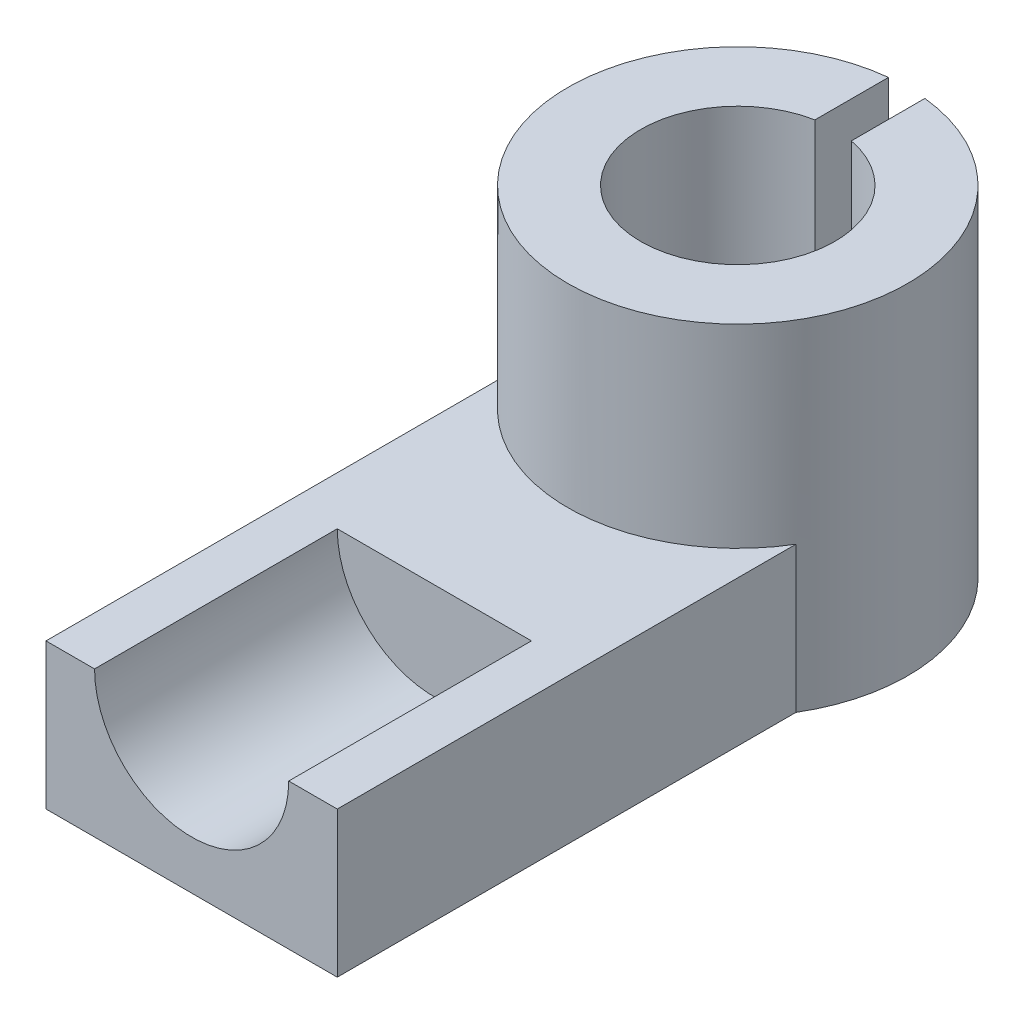
ISO-10303-21;
HEADER;
FILE_DESCRIPTION(('STEP AP214'),'2;1');
FILE_NAME('part.step','',(''),(''),'','','');
FILE_SCHEMA(('AUTOMOTIVE_DESIGN { 1 0 10303 214 1 1 1 1 }'));
ENDSEC;
DATA;
#1=APPLICATION_CONTEXT('core data for automotive mechanical design processes');
#2=APPLICATION_PROTOCOL_DEFINITION('international standard','automotive_design',2000,#1);
#3=PRODUCT_CONTEXT('',#1,'mechanical');
#4=PRODUCT('Part','Part','',(#3));
#5=PRODUCT_RELATED_PRODUCT_CATEGORY('part','',(#4));
#6=PRODUCT_DEFINITION_FORMATION('','',#4);
#7=PRODUCT_DEFINITION_CONTEXT('part definition',#1,'design');
#8=PRODUCT_DEFINITION('design','',#6,#7);
#9=PRODUCT_DEFINITION_SHAPE('','',#8);
#10=(LENGTH_UNIT() NAMED_UNIT(*) SI_UNIT(.MILLI.,.METRE.));
#11=(NAMED_UNIT(*) PLANE_ANGLE_UNIT() SI_UNIT($,.RADIAN.));
#12=(NAMED_UNIT(*) SI_UNIT($,.STERADIAN.) SOLID_ANGLE_UNIT());
#13=UNCERTAINTY_MEASURE_WITH_UNIT(LENGTH_MEASURE(1.E-05),#10,'distance_accuracy_value','');
#14=(GEOMETRIC_REPRESENTATION_CONTEXT(3) GLOBAL_UNCERTAINTY_ASSIGNED_CONTEXT((#13)) GLOBAL_UNIT_ASSIGNED_CONTEXT((#10,
#11,#12)) REPRESENTATION_CONTEXT('',''));
#15=CARTESIAN_POINT('',(0.,0.,0.));
#16=DIRECTION('',(0.,0.,1.));
#17=DIRECTION('',(1.,0.,0.));
#18=AXIS2_PLACEMENT_3D('',#15,#16,#17);
#19=CARTESIAN_POINT('',(0.,56.,0.));
#20=DIRECTION('',(0.,-1.,0.));
#21=DIRECTION('',(0.,0.,-1.));
#22=AXIS2_PLACEMENT_3D('',#19,#20,#21);
#23=CYLINDRICAL_SURFACE('',#22,28.);
#24=DIRECTION('',(0.,-1.,0.));
#25=VECTOR('',#24,1.);
#26=CARTESIAN_POINT('',(24.,24.,14.422205101856));
#27=LINE('',#26,#25);
#28=CARTESIAN_POINT('',(24.,24.,14.422205101856));
#29=VERTEX_POINT('',#28);
#30=CARTESIAN_POINT('',(24.,0.,14.422205101856));
#31=VERTEX_POINT('',#30);
#32=EDGE_CURVE('E172',#29,#31,#27,.T.);
#33=ORIENTED_EDGE('',*,*,#32,.T.);
#34=CARTESIAN_POINT('',(0.,0.,0.));
#35=DIRECTION('',(0.,1.,0.));
#36=DIRECTION('',(0.,0.,1.));
#37=AXIS2_PLACEMENT_3D('',#34,#35,#36);
#38=CIRCLE('',#37,28.);
#39=CARTESIAN_POINT('',(3.,0.,-27.8388218141501));
#40=VERTEX_POINT('',#39);
#41=EDGE_CURVE('E205',#31,#40,#38,.T.);
#42=ORIENTED_EDGE('',*,*,#41,.T.);
#43=DIRECTION('',(0.,-1.,0.));
#44=VECTOR('',#43,1.);
#45=CARTESIAN_POINT('',(3.,56.,-27.8388218141501));
#46=LINE('',#45,#44);
#47=CARTESIAN_POINT('',(3.,56.,-27.8388218141501));
#48=VERTEX_POINT('',#47);
#49=EDGE_CURVE('E196',#40,#48,#46,.F.);
#50=ORIENTED_EDGE('',*,*,#49,.T.);
#51=CARTESIAN_POINT('',(0.,56.,0.));
#52=DIRECTION('',(0.,1.,0.));
#53=DIRECTION('',(0.,0.,1.));
#54=AXIS2_PLACEMENT_3D('',#51,#52,#53);
#55=CIRCLE('',#54,28.);
#56=CARTESIAN_POINT('',(-3.,56.,-27.8388218141501));
#57=VERTEX_POINT('',#56);
#58=EDGE_CURVE('E209',#57,#48,#55,.T.);
#59=ORIENTED_EDGE('',*,*,#58,.F.);
#60=DIRECTION('',(0.,-1.,0.));
#61=VECTOR('',#60,1.);
#62=CARTESIAN_POINT('',(-3.,56.,-27.8388218141501));
#63=LINE('',#62,#61);
#64=CARTESIAN_POINT('',(-3.,0.,-27.8388218141501));
#65=VERTEX_POINT('',#64);
#66=EDGE_CURVE('E188',#57,#65,#63,.T.);
#67=ORIENTED_EDGE('',*,*,#66,.T.);
#68=CARTESIAN_POINT('',(-24.,0.,14.422205101856));
#69=VERTEX_POINT('',#68);
#70=EDGE_CURVE('E214',#65,#69,#38,.T.);
#71=ORIENTED_EDGE('',*,*,#70,.T.);
#72=DIRECTION('',(0.,-1.,0.));
#73=VECTOR('',#72,1.);
#74=CARTESIAN_POINT('',(-24.,24.,14.422205101856));
#75=LINE('',#74,#73);
#76=CARTESIAN_POINT('',(-24.,24.,14.422205101856));
#77=VERTEX_POINT('',#76);
#78=EDGE_CURVE('E65',#77,#69,#75,.T.);
#79=ORIENTED_EDGE('',*,*,#78,.F.);
#80=CARTESIAN_POINT('',(0.,24.,0.));
#81=DIRECTION('',(0.,-1.,0.));
#82=DIRECTION('',(0.,0.,-1.));
#83=AXIS2_PLACEMENT_3D('',#80,#81,#82);
#84=CIRCLE('',#83,28.);
#85=EDGE_CURVE('E154',#29,#77,#84,.T.);
#86=ORIENTED_EDGE('',*,*,#85,.F.);
#87=EDGE_LOOP('',(#33,#42,#50,#59,#67,#71,#79,#86));
#88=FACE_BOUND('',#87,.T.);
#89=ADVANCED_FACE('F43',(#88),#23,.T.);
#90=CARTESIAN_POINT('',(0.,56.,0.));
#91=DIRECTION('',(0.,1.,0.));
#92=DIRECTION('',(0.,0.,1.));
#93=AXIS2_PLACEMENT_3D('',#90,#91,#92);
#94=PLANE('',#93);
#95=DIRECTION('',(0.,0.,-1.));
#96=VECTOR('',#95,1.);
#97=CARTESIAN_POINT('',(3.,56.,-2.71923363166212));
#98=LINE('',#97,#96);
#99=CARTESIAN_POINT('',(3.,56.,-15.7162336455017));
#100=VERTEX_POINT('',#99);
#101=EDGE_CURVE('E178',#100,#48,#98,.T.);
#102=ORIENTED_EDGE('',*,*,#101,.F.);
#103=CARTESIAN_POINT('',(0.,56.,0.));
#104=DIRECTION('',(0.,1.,0.));
#105=DIRECTION('',(0.,0.,1.));
#106=AXIS2_PLACEMENT_3D('',#103,#104,#105);
#107=CIRCLE('',#106,16.);
#108=CARTESIAN_POINT('',(-3.,56.,-15.7162336455017));
#109=VERTEX_POINT('',#108);
#110=EDGE_CURVE('E201',#109,#100,#107,.T.);
#111=ORIENTED_EDGE('',*,*,#110,.F.);
#112=DIRECTION('',(0.,0.,1.));
#113=VECTOR('',#112,1.);
#114=CARTESIAN_POINT('',(-3.,56.,-2.71923363166212));
#115=LINE('',#114,#113);
#116=EDGE_CURVE('E184',#57,#109,#115,.T.);
#117=ORIENTED_EDGE('',*,*,#116,.F.);
#118=ORIENTED_EDGE('',*,*,#58,.T.);
#119=EDGE_LOOP('',(#102,#111,#117,#118));
#120=FACE_BOUND('',#119,.T.);
#121=ADVANCED_FACE('F243',(#120),#94,.T.);
#122=CARTESIAN_POINT('',(0.,0.,0.));
#123=DIRECTION('',(0.,1.,0.));
#124=DIRECTION('',(0.,0.,1.));
#125=AXIS2_PLACEMENT_3D('',#122,#123,#124);
#126=PLANE('',#125);
#127=CARTESIAN_POINT('',(0.,0.,0.));
#128=DIRECTION('',(0.,1.,0.));
#129=DIRECTION('',(0.,0.,1.));
#130=AXIS2_PLACEMENT_3D('',#127,#128,#129);
#131=CIRCLE('',#130,16.);
#132=CARTESIAN_POINT('',(-3.,0.,-15.7162336455017));
#133=VERTEX_POINT('',#132);
#134=CARTESIAN_POINT('',(3.,0.,-15.7162336455017));
#135=VERTEX_POINT('',#134);
#136=EDGE_CURVE('E200',#133,#135,#131,.T.);
#137=ORIENTED_EDGE('',*,*,#136,.T.);
#138=DIRECTION('',(0.,0.,-1.));
#139=VECTOR('',#138,1.);
#140=CARTESIAN_POINT('',(3.,0.,-2.71923363166212));
#141=LINE('',#140,#139);
#142=EDGE_CURVE('E179',#135,#40,#141,.T.);
#143=ORIENTED_EDGE('',*,*,#142,.T.);
#144=ORIENTED_EDGE('',*,*,#41,.F.);
#145=DIRECTION('',(0.,0.,-1.));
#146=VECTOR('',#145,1.);
#147=CARTESIAN_POINT('',(24.,0.,90.));
#148=LINE('',#147,#146);
#149=CARTESIAN_POINT('',(24.,0.,90.));
#150=VERTEX_POINT('',#149);
#151=EDGE_CURVE('E148',#150,#31,#148,.T.);
#152=ORIENTED_EDGE('',*,*,#151,.F.);
#153=DIRECTION('',(1.,0.,0.));
#154=VECTOR('',#153,1.);
#155=CARTESIAN_POINT('',(-24.,0.,90.));
#156=LINE('',#155,#154);
#157=CARTESIAN_POINT('',(-24.,0.,90.));
#158=VERTEX_POINT('',#157);
#159=EDGE_CURVE('E162',#158,#150,#156,.T.);
#160=ORIENTED_EDGE('',*,*,#159,.F.);
#161=DIRECTION('',(0.,0.,-1.));
#162=VECTOR('',#161,1.);
#163=CARTESIAN_POINT('',(-24.,0.,90.));
#164=LINE('',#163,#162);
#165=EDGE_CURVE('E142',#158,#69,#164,.T.);
#166=ORIENTED_EDGE('',*,*,#165,.T.);
#167=ORIENTED_EDGE('',*,*,#70,.F.);
#168=DIRECTION('',(0.,0.,1.));
#169=VECTOR('',#168,1.);
#170=CARTESIAN_POINT('',(-3.,0.,-2.71923363166212));
#171=LINE('',#170,#169);
#172=EDGE_CURVE('E183',#65,#133,#171,.T.);
#173=ORIENTED_EDGE('',*,*,#172,.T.);
#174=EDGE_LOOP('',(#137,#143,#144,#152,#160,#166,#167,#173));
#175=FACE_BOUND('',#174,.T.);
#176=ADVANCED_FACE('F229',(#175),#126,.F.);
#177=CARTESIAN_POINT('',(0.,56.,0.));
#178=DIRECTION('',(0.,-1.,0.));
#179=DIRECTION('',(0.,0.,-1.));
#180=AXIS2_PLACEMENT_3D('',#177,#178,#179);
#181=CYLINDRICAL_SURFACE('',#180,16.);
#182=DIRECTION('',(0.,-1.,0.));
#183=VECTOR('',#182,1.);
#184=CARTESIAN_POINT('',(3.,56.,-15.7162336455017));
#185=LINE('',#184,#183);
#186=EDGE_CURVE('E219',#135,#100,#185,.F.);
#187=ORIENTED_EDGE('',*,*,#186,.F.);
#188=ORIENTED_EDGE('',*,*,#136,.F.);
#189=DIRECTION('',(0.,-1.,0.));
#190=VECTOR('',#189,1.);
#191=CARTESIAN_POINT('',(-3.,56.,-15.7162336455017));
#192=LINE('',#191,#190);
#193=EDGE_CURVE('E213',#109,#133,#192,.T.);
#194=ORIENTED_EDGE('',*,*,#193,.F.);
#195=ORIENTED_EDGE('',*,*,#110,.T.);
#196=EDGE_LOOP('',(#187,#188,#194,#195));
#197=FACE_BOUND('',#196,.T.);
#198=ADVANCED_FACE('F260',(#197),#181,.F.);
#199=CARTESIAN_POINT('',(-3.,0.,-2.71923363166212));
#200=DIRECTION('',(-1.,0.,0.));
#201=DIRECTION('',(0.,0.,1.));
#202=AXIS2_PLACEMENT_3D('',#199,#200,#201);
#203=PLANE('',#202);
#204=ORIENTED_EDGE('',*,*,#116,.T.);
#205=ORIENTED_EDGE('',*,*,#193,.T.);
#206=ORIENTED_EDGE('',*,*,#172,.F.);
#207=ORIENTED_EDGE('',*,*,#66,.F.);
#208=EDGE_LOOP('',(#204,#205,#206,#207));
#209=FACE_BOUND('',#208,.T.);
#210=ADVANCED_FACE('F264',(#209),#203,.F.);
#211=CARTESIAN_POINT('',(3.,0.,-2.71923363166212));
#212=DIRECTION('',(1.,0.,0.));
#213=DIRECTION('',(0.,0.,-1.));
#214=AXIS2_PLACEMENT_3D('',#211,#212,#213);
#215=PLANE('',#214);
#216=ORIENTED_EDGE('',*,*,#142,.F.);
#217=ORIENTED_EDGE('',*,*,#186,.T.);
#218=ORIENTED_EDGE('',*,*,#101,.T.);
#219=ORIENTED_EDGE('',*,*,#49,.F.);
#220=EDGE_LOOP('',(#216,#217,#218,#219));
#221=FACE_BOUND('',#220,.T.);
#222=ADVANCED_FACE('F254',(#221),#215,.F.);
#223=CARTESIAN_POINT('',(-24.,24.,90.));
#224=DIRECTION('',(0.,0.,-1.));
#225=DIRECTION('',(-1.,0.,0.));
#226=AXIS2_PLACEMENT_3D('',#223,#224,#225);
#227=PLANE('',#226);
#228=DIRECTION('',(1.,0.,0.));
#229=VECTOR('',#228,1.);
#230=CARTESIAN_POINT('',(-24.,24.,90.));
#231=LINE('',#230,#229);
#232=CARTESIAN_POINT('',(16.,24.,90.));
#233=VERTEX_POINT('',#232);
#234=CARTESIAN_POINT('',(24.,24.,90.));
#235=VERTEX_POINT('',#234);
#236=EDGE_CURVE('E132',#233,#235,#231,.T.);
#237=ORIENTED_EDGE('',*,*,#236,.F.);
#238=CARTESIAN_POINT('',(0.,24.,90.));
#239=DIRECTION('',(0.,0.,1.));
#240=DIRECTION('',(1.,0.,0.));
#241=AXIS2_PLACEMENT_3D('',#238,#239,#240);
#242=CIRCLE('',#241,16.);
#243=CARTESIAN_POINT('',(-16.,24.,90.));
#244=VERTEX_POINT('',#243);
#245=EDGE_CURVE('E119',#244,#233,#242,.T.);
#246=ORIENTED_EDGE('',*,*,#245,.F.);
#247=CARTESIAN_POINT('',(-24.,24.,90.));
#248=VERTEX_POINT('',#247);
#249=EDGE_CURVE('E141',#248,#244,#231,.T.);
#250=ORIENTED_EDGE('',*,*,#249,.F.);
#251=DIRECTION('',(0.,-1.,0.));
#252=VECTOR('',#251,1.);
#253=CARTESIAN_POINT('',(-24.,24.,90.));
#254=LINE('',#253,#252);
#255=EDGE_CURVE('E161',#248,#158,#254,.T.);
#256=ORIENTED_EDGE('',*,*,#255,.T.);
#257=ORIENTED_EDGE('',*,*,#159,.T.);
#258=DIRECTION('',(0.,-1.,0.));
#259=VECTOR('',#258,1.);
#260=CARTESIAN_POINT('',(24.,24.,90.));
#261=LINE('',#260,#259);
#262=EDGE_CURVE('E139',#235,#150,#261,.T.);
#263=ORIENTED_EDGE('',*,*,#262,.F.);
#264=EDGE_LOOP('',(#237,#246,#250,#256,#257,#263));
#265=FACE_BOUND('',#264,.T.);
#266=ADVANCED_FACE('F136',(#265),#227,.F.);
#267=CARTESIAN_POINT('',(24.,24.,90.));
#268=DIRECTION('',(-1.,0.,0.));
#269=DIRECTION('',(0.,0.,1.));
#270=AXIS2_PLACEMENT_3D('',#267,#268,#269);
#271=PLANE('',#270);
#272=ORIENTED_EDGE('',*,*,#151,.T.);
#273=ORIENTED_EDGE('',*,*,#32,.F.);
#274=DIRECTION('',(0.,0.,-1.));
#275=VECTOR('',#274,1.);
#276=CARTESIAN_POINT('',(24.,24.,90.));
#277=LINE('',#276,#275);
#278=EDGE_CURVE('E146',#235,#29,#277,.T.);
#279=ORIENTED_EDGE('',*,*,#278,.F.);
#280=ORIENTED_EDGE('',*,*,#262,.T.);
#281=EDGE_LOOP('',(#272,#273,#279,#280));
#282=FACE_BOUND('',#281,.T.);
#283=ADVANCED_FACE('F233',(#282),#271,.F.);
#284=CARTESIAN_POINT('',(-24.,24.,90.));
#285=DIRECTION('',(-1.,0.,0.));
#286=DIRECTION('',(0.,0.,1.));
#287=AXIS2_PLACEMENT_3D('',#284,#285,#286);
#288=PLANE('',#287);
#289=ORIENTED_EDGE('',*,*,#165,.F.);
#290=ORIENTED_EDGE('',*,*,#255,.F.);
#291=DIRECTION('',(0.,0.,-1.));
#292=VECTOR('',#291,1.);
#293=CARTESIAN_POINT('',(-24.,24.,90.));
#294=LINE('',#293,#292);
#295=EDGE_CURVE('E157',#248,#77,#294,.T.);
#296=ORIENTED_EDGE('',*,*,#295,.T.);
#297=ORIENTED_EDGE('',*,*,#78,.T.);
#298=EDGE_LOOP('',(#289,#290,#296,#297));
#299=FACE_BOUND('',#298,.T.);
#300=ADVANCED_FACE('F231',(#299),#288,.T.);
#301=CARTESIAN_POINT('',(0.,24.,0.));
#302=DIRECTION('',(0.,-1.,0.));
#303=DIRECTION('',(0.,0.,-1.));
#304=AXIS2_PLACEMENT_3D('',#301,#302,#303);
#305=PLANE('',#304);
#306=DIRECTION('',(-1.,0.,0.));
#307=VECTOR('',#306,1.);
#308=CARTESIAN_POINT('',(0.,24.,50.));
#309=LINE('',#308,#307);
#310=CARTESIAN_POINT('',(16.,24.,50.));
#311=VERTEX_POINT('',#310);
#312=CARTESIAN_POINT('',(-16.,24.,50.));
#313=VERTEX_POINT('',#312);
#314=EDGE_CURVE('E134',#311,#313,#309,.T.);
#315=ORIENTED_EDGE('',*,*,#314,.F.);
#316=DIRECTION('',(0.,0.,1.));
#317=VECTOR('',#316,1.);
#318=CARTESIAN_POINT('',(16.,24.,50.));
#319=LINE('',#318,#317);
#320=EDGE_CURVE('E11',#311,#233,#319,.T.);
#321=ORIENTED_EDGE('',*,*,#320,.T.);
#322=ORIENTED_EDGE('',*,*,#236,.T.);
#323=ORIENTED_EDGE('',*,*,#278,.T.);
#324=ORIENTED_EDGE('',*,*,#85,.T.);
#325=ORIENTED_EDGE('',*,*,#295,.F.);
#326=ORIENTED_EDGE('',*,*,#249,.T.);
#327=DIRECTION('',(0.,0.,1.));
#328=VECTOR('',#327,1.);
#329=CARTESIAN_POINT('',(-16.,24.,50.));
#330=LINE('',#329,#328);
#331=EDGE_CURVE('E51',#244,#313,#330,.F.);
#332=ORIENTED_EDGE('',*,*,#331,.T.);
#333=EDGE_LOOP('',(#315,#321,#322,#323,#324,#325,#326,#332));
#334=FACE_BOUND('',#333,.T.);
#335=ADVANCED_FACE('F130',(#334),#305,.F.);
#336=CARTESIAN_POINT('',(0.,24.,50.));
#337=DIRECTION('',(0.,0.,1.));
#338=DIRECTION('',(1.,0.,0.));
#339=AXIS2_PLACEMENT_3D('',#336,#337,#338);
#340=CYLINDRICAL_SURFACE('',#339,16.);
#341=CARTESIAN_POINT('',(0.,24.,50.));
#342=DIRECTION('',(0.,0.,1.));
#343=DIRECTION('',(1.,0.,0.));
#344=AXIS2_PLACEMENT_3D('',#341,#342,#343);
#345=CIRCLE('',#344,16.);
#346=EDGE_CURVE('E57',#313,#311,#345,.T.);
#347=ORIENTED_EDGE('',*,*,#346,.F.);
#348=ORIENTED_EDGE('',*,*,#331,.F.);
#349=ORIENTED_EDGE('',*,*,#245,.T.);
#350=ORIENTED_EDGE('',*,*,#320,.F.);
#351=EDGE_LOOP('',(#347,#348,#349,#350));
#352=FACE_BOUND('',#351,.T.);
#353=ADVANCED_FACE('F120',(#352),#340,.F.);
#354=CARTESIAN_POINT('',(0.,24.,50.));
#355=DIRECTION('',(0.,0.,1.));
#356=DIRECTION('',(1.,0.,0.));
#357=AXIS2_PLACEMENT_3D('',#354,#355,#356);
#358=PLANE('',#357);
#359=ORIENTED_EDGE('',*,*,#314,.T.);
#360=ORIENTED_EDGE('',*,*,#346,.T.);
#361=EDGE_LOOP('',(#359,#360));
#362=FACE_BOUND('',#361,.T.);
#363=ADVANCED_FACE('F339',(#362),#358,.T.);
#364=CLOSED_SHELL('',(#89,#121,#176,#198,#210,#222,#266,#283,#300,#335,#353,#363));
#365=MANIFOLD_SOLID_BREP('B2',#364);
#366=ADVANCED_BREP_SHAPE_REPRESENTATION('',(#18,#365),#14);
#367=SHAPE_DEFINITION_REPRESENTATION(#9,#366);
ENDSEC;
END-ISO-10303-21;
